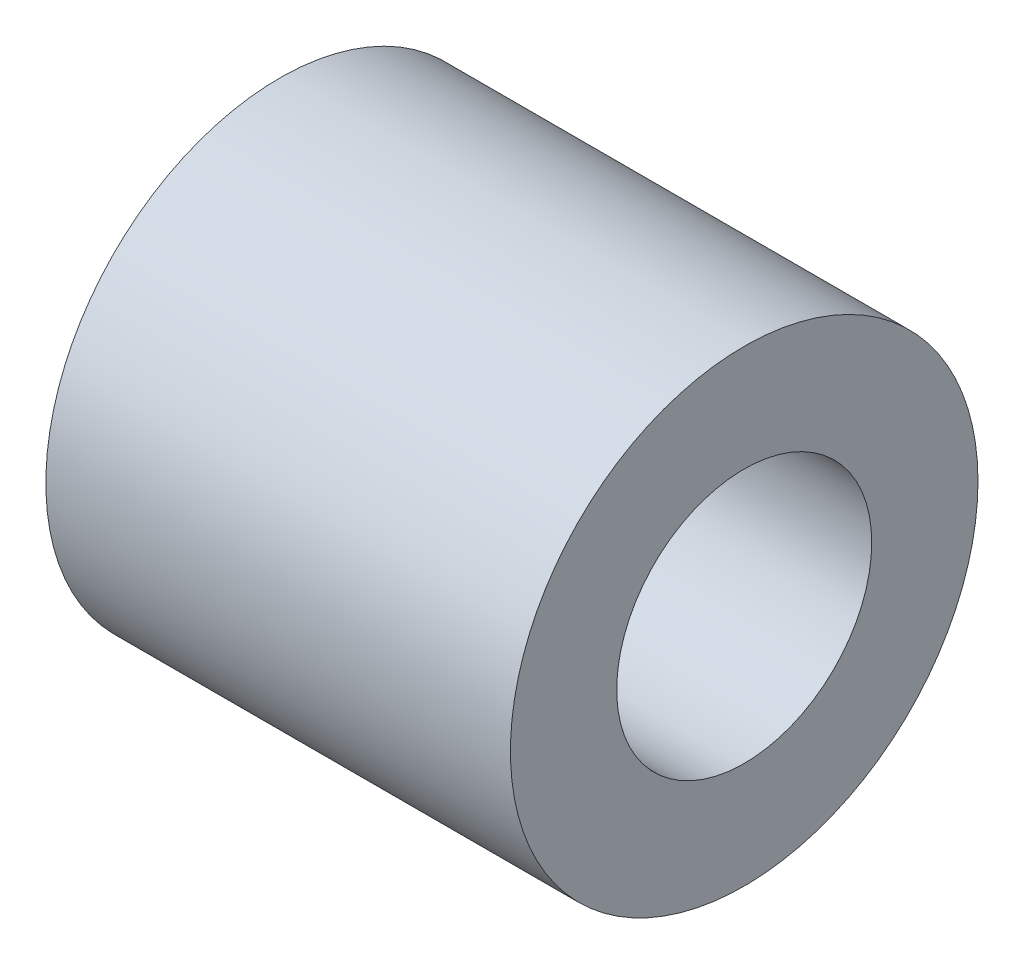
ISO-10303-21;
HEADER;
FILE_DESCRIPTION(('STEP AP214'),'2;1');
FILE_NAME('part.step','',(''),(''),'','','');
FILE_SCHEMA(('AUTOMOTIVE_DESIGN { 1 0 10303 214 1 1 1 1 }'));
ENDSEC;
DATA;
#1=APPLICATION_CONTEXT('core data for automotive mechanical design processes');
#2=APPLICATION_PROTOCOL_DEFINITION('international standard','automotive_design',2000,#1);
#3=PRODUCT_CONTEXT('',#1,'mechanical');
#4=PRODUCT('Part','Part','',(#3));
#5=PRODUCT_RELATED_PRODUCT_CATEGORY('part','',(#4));
#6=PRODUCT_DEFINITION_FORMATION('','',#4);
#7=PRODUCT_DEFINITION_CONTEXT('part definition',#1,'design');
#8=PRODUCT_DEFINITION('design','',#6,#7);
#9=PRODUCT_DEFINITION_SHAPE('','',#8);
#10=(LENGTH_UNIT() NAMED_UNIT(*) SI_UNIT(.MILLI.,.METRE.));
#11=(NAMED_UNIT(*) PLANE_ANGLE_UNIT() SI_UNIT($,.RADIAN.));
#12=(NAMED_UNIT(*) SI_UNIT($,.STERADIAN.) SOLID_ANGLE_UNIT());
#13=UNCERTAINTY_MEASURE_WITH_UNIT(LENGTH_MEASURE(1.E-05),#10,'distance_accuracy_value','');
#14=(GEOMETRIC_REPRESENTATION_CONTEXT(3) GLOBAL_UNCERTAINTY_ASSIGNED_CONTEXT((#13)) GLOBAL_UNIT_ASSIGNED_CONTEXT((#10,
#11,#12)) REPRESENTATION_CONTEXT('',''));
#15=CARTESIAN_POINT('',(0.,0.,0.));
#16=DIRECTION('',(0.,0.,1.));
#17=DIRECTION('',(1.,0.,0.));
#18=AXIS2_PLACEMENT_3D('',#15,#16,#17);
#19=CARTESIAN_POINT('',(10.93,0.,0.));
#20=DIRECTION('',(1.,0.,0.));
#21=DIRECTION('',(0.,0.,-1.));
#22=AXIS2_PLACEMENT_3D('',#19,#20,#21);
#23=PLANE('',#22);
#24=CARTESIAN_POINT('',(10.93,0.,0.));
#25=DIRECTION('',(1.,0.,0.));
#26=DIRECTION('',(0.,0.,-1.));
#27=AXIS2_PLACEMENT_3D('',#24,#25,#26);
#28=CIRCLE('',#27,5.5);
#29=CARTESIAN_POINT('',(10.93,0.,-5.5));
#30=VERTEX_POINT('',#29);
#31=EDGE_CURVE('E10',#30,#30,#28,.T.);
#32=ORIENTED_EDGE('',*,*,#31,.T.);
#33=EDGE_LOOP('',(#32));
#34=FACE_BOUND('',#33,.T.);
#35=CARTESIAN_POINT('',(10.93,0.,0.));
#36=DIRECTION('',(1.,0.,0.));
#37=DIRECTION('',(0.,0.,-1.));
#38=AXIS2_PLACEMENT_3D('',#35,#36,#37);
#39=CIRCLE('',#38,3.);
#40=CARTESIAN_POINT('',(10.93,0.,-3.));
#41=VERTEX_POINT('',#40);
#42=EDGE_CURVE('E44',#41,#41,#39,.T.);
#43=ORIENTED_EDGE('',*,*,#42,.F.);
#44=EDGE_LOOP('',(#43));
#45=FACE_BOUND('',#44,.T.);
#46=ADVANCED_FACE('F33',(#34,#45),#23,.T.);
#47=CARTESIAN_POINT('',(0.,0.,0.));
#48=DIRECTION('',(1.,0.,0.));
#49=DIRECTION('',(0.,0.,-1.));
#50=AXIS2_PLACEMENT_3D('',#47,#48,#49);
#51=PLANE('',#50);
#52=CARTESIAN_POINT('',(0.,0.,0.));
#53=DIRECTION('',(1.,0.,0.));
#54=DIRECTION('',(0.,0.,-1.));
#55=AXIS2_PLACEMENT_3D('',#52,#53,#54);
#56=CIRCLE('',#55,5.5);
#57=CARTESIAN_POINT('',(0.,0.,-5.5));
#58=VERTEX_POINT('',#57);
#59=EDGE_CURVE('E37',#58,#58,#56,.T.);
#60=ORIENTED_EDGE('',*,*,#59,.F.);
#61=EDGE_LOOP('',(#60));
#62=FACE_BOUND('',#61,.T.);
#63=CARTESIAN_POINT('',(0.,0.,0.));
#64=DIRECTION('',(1.,0.,0.));
#65=DIRECTION('',(0.,0.,-1.));
#66=AXIS2_PLACEMENT_3D('',#63,#64,#65);
#67=CIRCLE('',#66,3.);
#68=CARTESIAN_POINT('',(0.,0.,-3.));
#69=VERTEX_POINT('',#68);
#70=EDGE_CURVE('E46',#69,#69,#67,.T.);
#71=ORIENTED_EDGE('',*,*,#70,.T.);
#72=EDGE_LOOP('',(#71));
#73=FACE_BOUND('',#72,.T.);
#74=ADVANCED_FACE('F56',(#62,#73),#51,.F.);
#75=CARTESIAN_POINT('',(10.93,0.,0.));
#76=DIRECTION('',(-1.,0.,0.));
#77=DIRECTION('',(0.,0.,1.));
#78=AXIS2_PLACEMENT_3D('',#75,#76,#77);
#79=CYLINDRICAL_SURFACE('',#78,5.5);
#80=ORIENTED_EDGE('',*,*,#31,.F.);
#81=EDGE_LOOP('',(#80));
#82=FACE_BOUND('',#81,.T.);
#83=ORIENTED_EDGE('',*,*,#59,.T.);
#84=EDGE_LOOP('',(#83));
#85=FACE_BOUND('',#84,.T.);
#86=ADVANCED_FACE('F35',(#82,#85),#79,.T.);
#87=CARTESIAN_POINT('',(10.93,0.,0.));
#88=DIRECTION('',(-1.,0.,0.));
#89=DIRECTION('',(0.,0.,1.));
#90=AXIS2_PLACEMENT_3D('',#87,#88,#89);
#91=CYLINDRICAL_SURFACE('',#90,3.);
#92=ORIENTED_EDGE('',*,*,#42,.T.);
#93=EDGE_LOOP('',(#92));
#94=FACE_BOUND('',#93,.T.);
#95=ORIENTED_EDGE('',*,*,#70,.F.);
#96=EDGE_LOOP('',(#95));
#97=FACE_BOUND('',#96,.T.);
#98=ADVANCED_FACE('F52',(#94,#97),#91,.F.);
#99=CLOSED_SHELL('',(#46,#74,#86,#98));
#100=MANIFOLD_SOLID_BREP('B2',#99);
#101=ADVANCED_BREP_SHAPE_REPRESENTATION('',(#18,#100),#14);
#102=SHAPE_DEFINITION_REPRESENTATION(#9,#101);
ENDSEC;
END-ISO-10303-21;
